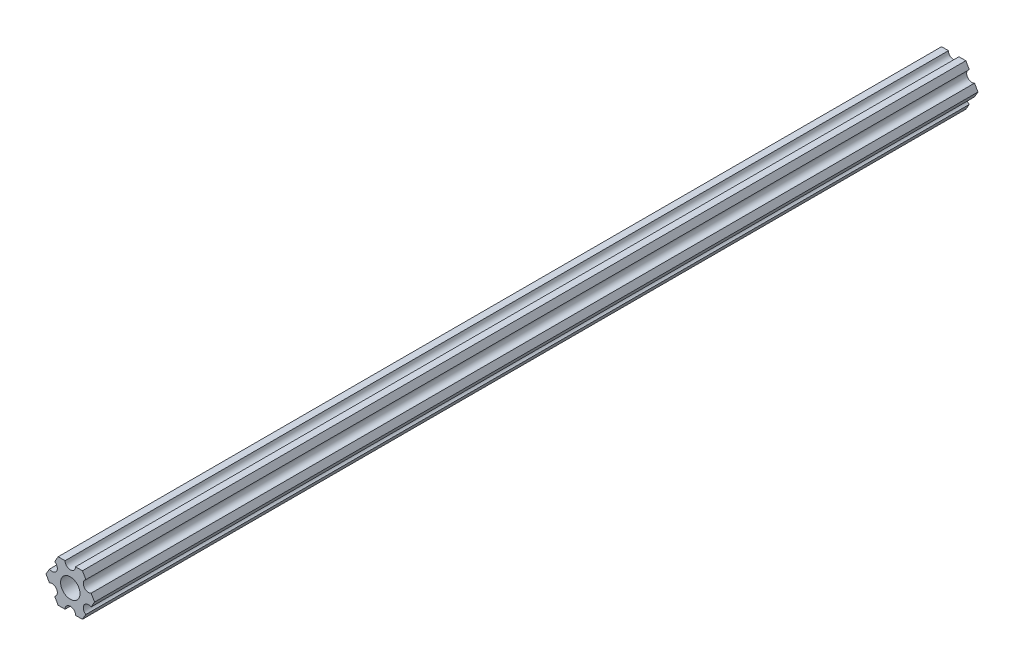
ISO-10303-21;
HEADER;
FILE_DESCRIPTION(('STEP AP214'),'2;1');
FILE_NAME('part.step','',(''),(''),'','','');
FILE_SCHEMA(('AUTOMOTIVE_DESIGN { 1 0 10303 214 1 1 1 1 }'));
ENDSEC;
DATA;
#1=APPLICATION_CONTEXT('core data for automotive mechanical design processes');
#2=APPLICATION_PROTOCOL_DEFINITION('international standard','automotive_design',2000,#1);
#3=PRODUCT_CONTEXT('',#1,'mechanical');
#4=PRODUCT('Part','Part','',(#3));
#5=PRODUCT_RELATED_PRODUCT_CATEGORY('part','',(#4));
#6=PRODUCT_DEFINITION_FORMATION('','',#4);
#7=PRODUCT_DEFINITION_CONTEXT('part definition',#1,'design');
#8=PRODUCT_DEFINITION('design','',#6,#7);
#9=PRODUCT_DEFINITION_SHAPE('','',#8);
#10=(LENGTH_UNIT() NAMED_UNIT(*) SI_UNIT(.MILLI.,.METRE.));
#11=(NAMED_UNIT(*) PLANE_ANGLE_UNIT() SI_UNIT($,.RADIAN.));
#12=(NAMED_UNIT(*) SI_UNIT($,.STERADIAN.) SOLID_ANGLE_UNIT());
#13=UNCERTAINTY_MEASURE_WITH_UNIT(LENGTH_MEASURE(1.E-05),#10,'distance_accuracy_value','');
#14=(GEOMETRIC_REPRESENTATION_CONTEXT(3) GLOBAL_UNCERTAINTY_ASSIGNED_CONTEXT((#13)) GLOBAL_UNIT_ASSIGNED_CONTEXT((#10,
#11,#12)) REPRESENTATION_CONTEXT('',''));
#15=CARTESIAN_POINT('',(0.,0.,0.));
#16=DIRECTION('',(0.,0.,1.));
#17=DIRECTION('',(1.,0.,0.));
#18=AXIS2_PLACEMENT_3D('',#15,#16,#17);
#19=CARTESIAN_POINT('',(6.29301142309098,-1.80018429024546,85.725));
#20=DIRECTION('',(-0.866025434075723,0.499999947533953,0.));
#21=DIRECTION('',(0.,0.,1.));
#22=AXIS2_PLACEMENT_3D('',#19,#20,#21);
#23=PLANE('',#22);
#24=DIRECTION('',(0.,0.,1.));
#25=VECTOR('',#24,1.);
#26=CARTESIAN_POINT('',(7.33234841870827,4.44212519169686E-07,85.725));
#27=LINE('',#26,#25);
#28=CARTESIAN_POINT('',(7.33234841870826,4.44212518961143E-07,0.));
#29=VERTEX_POINT('',#28);
#30=CARTESIAN_POINT('',(7.33234841870826,4.44212518961143E-07,266.7));
#31=VERTEX_POINT('',#30);
#32=EDGE_CURVE('E12',#29,#31,#27,.T.);
#33=ORIENTED_EDGE('',*,*,#32,.T.);
#34=DIRECTION('',(-0.499999947533953,-0.866025434075723,0.));
#35=VECTOR('',#34,1.);
#36=CARTESIAN_POINT('',(6.29301142309098,-1.80018429024546,266.7));
#37=LINE('',#36,#35);
#38=CARTESIAN_POINT('',(6.29301142309098,-1.80018429024546,266.7));
#39=VERTEX_POINT('',#38);
#40=EDGE_CURVE('E221',#31,#39,#37,.T.);
#41=ORIENTED_EDGE('',*,*,#40,.T.);
#42=DIRECTION('',(0.,0.,-1.));
#43=VECTOR('',#42,1.);
#44=CARTESIAN_POINT('',(6.29301142309098,-1.80018429024546,85.725));
#45=LINE('',#44,#43);
#46=CARTESIAN_POINT('',(6.29301142309098,-1.80018429024546,0.));
#47=VERTEX_POINT('',#46);
#48=EDGE_CURVE('E186',#39,#47,#45,.T.);
#49=ORIENTED_EDGE('',*,*,#48,.T.);
#50=DIRECTION('',(0.499999947533953,0.866025434075723,0.));
#51=VECTOR('',#50,1.);
#52=CARTESIAN_POINT('',(6.29301142309098,-1.80018429024546,0.));
#53=LINE('',#52,#51);
#54=EDGE_CURVE('E140',#47,#29,#53,.T.);
#55=ORIENTED_EDGE('',*,*,#54,.T.);
#56=EDGE_LOOP('',(#33,#41,#49,#55));
#57=FACE_BOUND('',#56,.T.);
#58=ADVANCED_FACE('F51',(#57),#23,.F.);
#59=CARTESIAN_POINT('',(7.33234841870827,4.44212519169686E-07,85.725));
#60=DIRECTION('',(-0.866025373493145,-0.500000052466057,0.));
#61=DIRECTION('',(-0.500000052466057,0.866025373493145,0.));
#62=AXIS2_PLACEMENT_3D('',#59,#60,#61);
#63=PLANE('',#62);
#64=DIRECTION('',(0.,0.,1.));
#65=VECTOR('',#64,1.);
#66=CARTESIAN_POINT('',(6.29301120497139,1.80018505273894,85.725));
#67=LINE('',#66,#65);
#68=CARTESIAN_POINT('',(6.29301120497139,1.80018505273894,0.));
#69=VERTEX_POINT('',#68);
#70=CARTESIAN_POINT('',(6.29301120497139,1.80018505273894,266.7));
#71=VERTEX_POINT('',#70);
#72=EDGE_CURVE('E61',#69,#71,#67,.T.);
#73=ORIENTED_EDGE('',*,*,#72,.T.);
#74=DIRECTION('',(0.500000052466055,-0.866025373493146,0.));
#75=VECTOR('',#74,1.);
#76=CARTESIAN_POINT('',(7.33234841870826,4.44212518961143E-07,266.7));
#77=LINE('',#76,#75);
#78=EDGE_CURVE('E217',#71,#31,#77,.T.);
#79=ORIENTED_EDGE('',*,*,#78,.T.);
#80=ORIENTED_EDGE('',*,*,#32,.F.);
#81=DIRECTION('',(-0.500000052466057,0.866025373493145,0.));
#82=VECTOR('',#81,1.);
#83=CARTESIAN_POINT('',(7.33234841870827,4.44212519198906E-07,0.));
#84=LINE('',#83,#82);
#85=EDGE_CURVE('E139',#29,#69,#84,.T.);
#86=ORIENTED_EDGE('',*,*,#85,.T.);
#87=EDGE_LOOP('',(#73,#79,#80,#86));
#88=FACE_BOUND('',#87,.T.);
#89=ADVANCED_FACE('F484',(#88),#63,.F.);
#90=CARTESIAN_POINT('',(4.70551103839172,4.54981561357972,85.725));
#91=DIRECTION('',(-0.866025373493151,-0.500000052466046,0.));
#92=DIRECTION('',(-0.500000052466046,0.866025373493151,0.));
#93=AXIS2_PLACEMENT_3D('',#90,#91,#92);
#94=PLANE('',#93);
#95=DIRECTION('',(0.,0.,1.));
#96=VECTOR('',#95,1.);
#97=CARTESIAN_POINT('',(3.66617382465481,6.35000022210627,85.725));
#98=LINE('',#97,#96);
#99=CARTESIAN_POINT('',(3.66617382465481,6.35000022210627,0.));
#100=VERTEX_POINT('',#99);
#101=CARTESIAN_POINT('',(3.66617382465481,6.35000022210627,266.7));
#102=VERTEX_POINT('',#101);
#103=EDGE_CURVE('E91',#100,#102,#98,.T.);
#104=ORIENTED_EDGE('',*,*,#103,.T.);
#105=DIRECTION('',(0.500000052466045,-0.866025373493151,0.));
#106=VECTOR('',#105,1.);
#107=CARTESIAN_POINT('',(4.70551103839172,4.54981561357972,266.7));
#108=LINE('',#107,#106);
#109=CARTESIAN_POINT('',(4.70551103839172,4.54981561357972,266.7));
#110=VERTEX_POINT('',#109);
#111=EDGE_CURVE('E227',#102,#110,#108,.T.);
#112=ORIENTED_EDGE('',*,*,#111,.T.);
#113=DIRECTION('',(0.,0.,1.));
#114=VECTOR('',#113,1.);
#115=CARTESIAN_POINT('',(4.70551103839172,4.54981561357972,85.725));
#116=LINE('',#115,#114);
#117=CARTESIAN_POINT('',(4.70551103839172,4.54981561357972,0.));
#118=VERTEX_POINT('',#117);
#119=EDGE_CURVE('E113',#118,#110,#116,.T.);
#120=ORIENTED_EDGE('',*,*,#119,.F.);
#121=DIRECTION('',(-0.500000052466046,0.866025373493151,0.));
#122=VECTOR('',#121,1.);
#123=CARTESIAN_POINT('',(4.70551103839172,4.54981561357972,0.));
#124=LINE('',#123,#122);
#125=EDGE_CURVE('E109',#118,#100,#124,.T.);
#126=ORIENTED_EDGE('',*,*,#125,.T.);
#127=EDGE_LOOP('',(#104,#112,#120,#126));
#128=FACE_BOUND('',#127,.T.);
#129=ADVANCED_FACE('F110',(#128),#94,.F.);
#130=CARTESIAN_POINT('',(3.66617382465481,6.35000022210627,85.725));
#131=DIRECTION('',(6.05825850611185E-08,-1.,0.));
#132=DIRECTION('',(0.,0.,-1.));
#133=AXIS2_PLACEMENT_3D('',#130,#131,#132);
#134=PLANE('',#133);
#135=DIRECTION('',(0.,0.,1.));
#136=VECTOR('',#135,1.);
#137=CARTESIAN_POINT('',(1.58749961530074,6.35000009617482,85.725));
#138=LINE('',#137,#136);
#139=CARTESIAN_POINT('',(1.58749961530073,6.35000015914054,0.));
#140=VERTEX_POINT('',#139);
#141=CARTESIAN_POINT('',(1.58749961530074,6.35,266.7));
#142=VERTEX_POINT('',#141);
#143=EDGE_CURVE('E105',#140,#142,#138,.T.);
#144=ORIENTED_EDGE('',*,*,#143,.T.);
#145=DIRECTION('',(1.,3.02912931564594E-08,0.));
#146=VECTOR('',#145,1.);
#147=CARTESIAN_POINT('',(3.66617382465481,6.35000022210627,266.7));
#148=LINE('',#147,#146);
#149=EDGE_CURVE('E100',#142,#102,#148,.T.);
#150=ORIENTED_EDGE('',*,*,#149,.T.);
#151=ORIENTED_EDGE('',*,*,#103,.F.);
#152=DIRECTION('',(-1.,0.,0.));
#153=VECTOR('',#152,1.);
#154=CARTESIAN_POINT('',(5.49926112168156,6.35000022210627,0.));
#155=LINE('',#154,#153);
#156=EDGE_CURVE('E96',#100,#140,#155,.T.);
#157=ORIENTED_EDGE('',*,*,#156,.T.);
#158=EDGE_LOOP('',(#144,#150,#151,#157));
#159=FACE_BOUND('',#158,.T.);
#160=ADVANCED_FACE('F94',(#159),#134,.F.);
#161=CARTESIAN_POINT('',(-3.84699260060323E-07,6.35,85.725));
#162=DIRECTION('',(0.,0.,-1.));
#163=DIRECTION('',(-1.,0.,0.));
#164=AXIS2_PLACEMENT_3D('',#161,#162,#163);
#165=CYLINDRICAL_SURFACE('',#164,1.5875);
#166=DIRECTION('',(0.,0.,1.));
#167=VECTOR('',#166,1.);
#168=CARTESIAN_POINT('',(-1.58750038469926,6.34999990382518,85.725));
#169=LINE('',#168,#167);
#170=CARTESIAN_POINT('',(-1.58750038469926,6.34999990382519,0.));
#171=VERTEX_POINT('',#170);
#172=CARTESIAN_POINT('',(-1.58750038469926,6.34999990382519,266.7));
#173=VERTEX_POINT('',#172);
#174=EDGE_CURVE('E175',#171,#173,#169,.T.);
#175=ORIENTED_EDGE('',*,*,#174,.T.);
#176=CARTESIAN_POINT('',(-3.84699260060323E-07,6.35,266.7));
#177=DIRECTION('',(0.,0.,1.));
#178=DIRECTION('',(1.,0.,0.));
#179=AXIS2_PLACEMENT_3D('',#176,#177,#178);
#180=CIRCLE('',#179,1.5875);
#181=EDGE_CURVE('E230',#173,#142,#180,.T.);
#182=ORIENTED_EDGE('',*,*,#181,.T.);
#183=ORIENTED_EDGE('',*,*,#143,.F.);
#184=CARTESIAN_POINT('',(-3.84699260060323E-07,6.35,0.));
#185=DIRECTION('',(0.,0.,-1.));
#186=DIRECTION('',(-1.,0.,0.));
#187=AXIS2_PLACEMENT_3D('',#184,#185,#186);
#188=CIRCLE('',#187,1.5875);
#189=EDGE_CURVE('E124',#140,#171,#188,.T.);
#190=ORIENTED_EDGE('',*,*,#189,.T.);
#191=EDGE_LOOP('',(#175,#182,#183,#190));
#192=FACE_BOUND('',#191,.T.);
#193=ADVANCED_FACE('F490',(#192),#165,.F.);
#194=CARTESIAN_POINT('',(-1.58750038469926,6.34999990382518,85.725));
#195=DIRECTION('',(6.05825963273174E-08,-1.,0.));
#196=DIRECTION('',(0.,0.,-1.));
#197=AXIS2_PLACEMENT_3D('',#194,#195,#196);
#198=PLANE('',#197);
#199=DIRECTION('',(0.,0.,1.));
#200=VECTOR('',#199,1.);
#201=CARTESIAN_POINT('',(-3.66617459405349,6.3499997778937,85.725));
#202=LINE('',#201,#200);
#203=CARTESIAN_POINT('',(-3.66617454558244,6.34999986184803,0.));
#204=VERTEX_POINT('',#203);
#205=CARTESIAN_POINT('',(-3.66617454558244,6.34999986184803,266.7));
#206=VERTEX_POINT('',#205);
#207=EDGE_CURVE('E171',#204,#206,#202,.T.);
#208=ORIENTED_EDGE('',*,*,#207,.T.);
#209=DIRECTION('',(1.,2.0194198968488E-08,0.));
#210=VECTOR('',#209,1.);
#211=CARTESIAN_POINT('',(-1.58750038469926,6.34999990382519,266.7));
#212=LINE('',#211,#210);
#213=EDGE_CURVE('E233',#206,#173,#212,.T.);
#214=ORIENTED_EDGE('',*,*,#213,.T.);
#215=ORIENTED_EDGE('',*,*,#174,.F.);
#216=DIRECTION('',(-1.,0.,0.));
#217=VECTOR('',#216,1.);
#218=CARTESIAN_POINT('',(5.49926112168156,6.34999990382519,0.));
#219=LINE('',#218,#217);
#220=EDGE_CURVE('E132',#171,#204,#219,.T.);
#221=ORIENTED_EDGE('',*,*,#220,.T.);
#222=EDGE_LOOP('',(#208,#214,#215,#221));
#223=FACE_BOUND('',#222,.T.);
#224=ADVANCED_FACE('F356',(#223),#198,.F.);
#225=CARTESIAN_POINT('',(-3.66617459405349,6.3499997778937,85.725));
#226=DIRECTION('',(0.866025434075729,-0.499999947533942,0.));
#227=DIRECTION('',(0.,0.,-1.));
#228=AXIS2_PLACEMENT_3D('',#225,#226,#227);
#229=PLANE('',#228);
#230=DIRECTION('',(0.,0.,1.));
#231=VECTOR('',#230,1.);
#232=CARTESIAN_POINT('',(-4.70551158967065,4.54981504343587,85.725));
#233=LINE('',#232,#231);
#234=CARTESIAN_POINT('',(-4.70551158967065,4.54981504343587,0.));
#235=VERTEX_POINT('',#234);
#236=CARTESIAN_POINT('',(-4.70551158967065,4.54981504343587,266.7));
#237=VERTEX_POINT('',#236);
#238=EDGE_CURVE('E170',#235,#237,#233,.T.);
#239=ORIENTED_EDGE('',*,*,#238,.T.);
#240=DIRECTION('',(0.499999947533939,0.866025434075731,0.));
#241=VECTOR('',#240,1.);
#242=CARTESIAN_POINT('',(-3.66617454558244,6.34999986184803,266.7));
#243=LINE('',#242,#241);
#244=EDGE_CURVE('E236',#237,#206,#243,.T.);
#245=ORIENTED_EDGE('',*,*,#244,.T.);
#246=ORIENTED_EDGE('',*,*,#207,.F.);
#247=DIRECTION('',(-0.499999947533943,-0.866025434075729,0.));
#248=VECTOR('',#247,1.);
#249=CARTESIAN_POINT('',(-3.66617459405349,6.3499997778937,0.));
#250=LINE('',#249,#248);
#251=EDGE_CURVE('E340',#204,#235,#250,.T.);
#252=ORIENTED_EDGE('',*,*,#251,.T.);
#253=EDGE_LOOP('',(#239,#245,#246,#252));
#254=FACE_BOUND('',#253,.T.);
#255=ADVANCED_FACE('F583',(#254),#229,.F.);
#256=CARTESIAN_POINT('',(-5.49926150638082,3.17499966684067,85.725));
#257=DIRECTION('',(0.,0.,-1.));
#258=DIRECTION('',(-1.,0.,0.));
#259=AXIS2_PLACEMENT_3D('',#256,#257,#258);
#260=CYLINDRICAL_SURFACE('',#259,1.5875);
#261=DIRECTION('',(0.,0.,1.));
#262=VECTOR('',#261,1.);
#263=CARTESIAN_POINT('',(-6.29301142309098,1.80018429024547,85.725));
#264=LINE('',#263,#262);
#265=CARTESIAN_POINT('',(-6.29301142309098,1.80018429024547,0.));
#266=VERTEX_POINT('',#265);
#267=CARTESIAN_POINT('',(-6.29301142309098,1.80018429024546,266.7));
#268=VERTEX_POINT('',#267);
#269=EDGE_CURVE('E148',#266,#268,#264,.T.);
#270=ORIENTED_EDGE('',*,*,#269,.T.);
#271=CARTESIAN_POINT('',(-5.49926150638082,3.17499966684067,266.7));
#272=DIRECTION('',(0.,0.,1.));
#273=DIRECTION('',(1.,0.,0.));
#274=AXIS2_PLACEMENT_3D('',#271,#272,#273);
#275=CIRCLE('',#274,1.5875);
#276=EDGE_CURVE('E239',#268,#237,#275,.T.);
#277=ORIENTED_EDGE('',*,*,#276,.T.);
#278=ORIENTED_EDGE('',*,*,#238,.F.);
#279=CARTESIAN_POINT('',(-5.49926150638082,3.17499966684067,0.));
#280=DIRECTION('',(0.,0.,-1.));
#281=DIRECTION('',(-1.,0.,0.));
#282=AXIS2_PLACEMENT_3D('',#279,#280,#281);
#283=CIRCLE('',#282,1.5875);
#284=EDGE_CURVE('E337',#235,#266,#283,.T.);
#285=ORIENTED_EDGE('',*,*,#284,.T.);
#286=EDGE_LOOP('',(#270,#277,#278,#285));
#287=FACE_BOUND('',#286,.T.);
#288=ADVANCED_FACE('F367',(#287),#260,.F.);
#289=CARTESIAN_POINT('',(-6.29301142309098,1.80018429024547,85.725));
#290=DIRECTION('',(0.866025434075724,-0.499999947533952,0.));
#291=DIRECTION('',(0.,0.,-1.));
#292=AXIS2_PLACEMENT_3D('',#289,#290,#291);
#293=PLANE('',#292);
#294=DIRECTION('',(0.,0.,1.));
#295=VECTOR('',#294,1.);
#296=CARTESIAN_POINT('',(-7.33234841870827,-4.44212523790841E-07,85.725));
#297=LINE('',#296,#295);
#298=CARTESIAN_POINT('',(-7.33234841870826,-4.44212524036367E-07,0.));
#299=VERTEX_POINT('',#298);
#300=CARTESIAN_POINT('',(-7.33234841870826,-4.44212524036367E-07,266.7));
#301=VERTEX_POINT('',#300);
#302=EDGE_CURVE('E144',#299,#301,#297,.T.);
#303=ORIENTED_EDGE('',*,*,#302,.T.);
#304=DIRECTION('',(0.499999947533951,0.866025434075724,0.));
#305=VECTOR('',#304,1.);
#306=CARTESIAN_POINT('',(-6.29301142309098,1.80018429024547,266.7));
#307=LINE('',#306,#305);
#308=EDGE_CURVE('E242',#301,#268,#307,.T.);
#309=ORIENTED_EDGE('',*,*,#308,.T.);
#310=ORIENTED_EDGE('',*,*,#269,.F.);
#311=DIRECTION('',(-0.499999947533952,-0.866025434075724,0.));
#312=VECTOR('',#311,1.);
#313=CARTESIAN_POINT('',(-6.29301142309098,1.80018429024547,0.));
#314=LINE('',#313,#312);
#315=EDGE_CURVE('E333',#266,#299,#314,.T.);
#316=ORIENTED_EDGE('',*,*,#315,.T.);
#317=EDGE_LOOP('',(#303,#309,#310,#316));
#318=FACE_BOUND('',#317,.T.);
#319=ADVANCED_FACE('F620',(#318),#293,.F.);
#320=CARTESIAN_POINT('',(-7.33234841870827,-4.44212523790841E-07,85.725));
#321=DIRECTION('',(0.866025373493151,0.500000052466045,0.));
#322=DIRECTION('',(0.,0.,-1.));
#323=AXIS2_PLACEMENT_3D('',#320,#321,#322);
#324=PLANE('',#323);
#325=DIRECTION('',(0.,0.,1.));
#326=VECTOR('',#325,1.);
#327=CARTESIAN_POINT('',(-6.29301120497141,-1.80018505273897,85.725));
#328=LINE('',#327,#326);
#329=CARTESIAN_POINT('',(-6.29301120497141,-1.80018505273897,0.));
#330=VERTEX_POINT('',#329);
#331=CARTESIAN_POINT('',(-6.29301120497141,-1.80018505273896,266.7));
#332=VERTEX_POINT('',#331);
#333=EDGE_CURVE('E149',#330,#332,#328,.T.);
#334=ORIENTED_EDGE('',*,*,#333,.T.);
#335=DIRECTION('',(-0.500000052466045,0.866025373493152,0.));
#336=VECTOR('',#335,1.);
#337=CARTESIAN_POINT('',(-7.33234841870826,-4.44212524036367E-07,266.7));
#338=LINE('',#337,#336);
#339=EDGE_CURVE('E245',#332,#301,#338,.T.);
#340=ORIENTED_EDGE('',*,*,#339,.T.);
#341=ORIENTED_EDGE('',*,*,#302,.F.);
#342=DIRECTION('',(0.500000052466045,-0.866025373493151,0.));
#343=VECTOR('',#342,1.);
#344=CARTESIAN_POINT('',(-7.33234841870827,-4.44212523969395E-07,0.));
#345=LINE('',#344,#343);
#346=EDGE_CURVE('E312',#299,#330,#345,.T.);
#347=ORIENTED_EDGE('',*,*,#346,.T.);
#348=EDGE_LOOP('',(#334,#340,#341,#347));
#349=FACE_BOUND('',#348,.T.);
#350=ADVANCED_FACE('F644',(#349),#324,.F.);
#351=CARTESIAN_POINT('',(-5.49926112168156,-3.17500033315934,85.725));
#352=DIRECTION('',(0.,0.,-1.));
#353=DIRECTION('',(-1.,0.,0.));
#354=AXIS2_PLACEMENT_3D('',#351,#352,#353);
#355=CYLINDRICAL_SURFACE('',#354,1.5875);
#356=DIRECTION('',(0.,0.,1.));
#357=VECTOR('',#356,1.);
#358=CARTESIAN_POINT('',(-4.70551103839172,-4.54981561357972,85.725));
#359=LINE('',#358,#357);
#360=CARTESIAN_POINT('',(-4.70551103839172,-4.54981561357972,0.));
#361=VERTEX_POINT('',#360);
#362=CARTESIAN_POINT('',(-4.70551103839172,-4.54981561357972,266.7));
#363=VERTEX_POINT('',#362);
#364=EDGE_CURVE('E163',#361,#363,#359,.T.);
#365=ORIENTED_EDGE('',*,*,#364,.T.);
#366=CARTESIAN_POINT('',(-5.49926112168156,-3.17500033315934,266.7));
#367=DIRECTION('',(0.,0.,1.));
#368=DIRECTION('',(1.,0.,0.));
#369=AXIS2_PLACEMENT_3D('',#366,#367,#368);
#370=CIRCLE('',#369,1.5875);
#371=EDGE_CURVE('E248',#363,#332,#370,.T.);
#372=ORIENTED_EDGE('',*,*,#371,.T.);
#373=ORIENTED_EDGE('',*,*,#333,.F.);
#374=CARTESIAN_POINT('',(-5.49926112168156,-3.17500033315934,0.));
#375=DIRECTION('',(0.,0.,-1.));
#376=DIRECTION('',(-1.,0.,0.));
#377=AXIS2_PLACEMENT_3D('',#374,#375,#376);
#378=CIRCLE('',#377,1.5875);
#379=EDGE_CURVE('E308',#330,#361,#378,.T.);
#380=ORIENTED_EDGE('',*,*,#379,.T.);
#381=EDGE_LOOP('',(#365,#372,#373,#380));
#382=FACE_BOUND('',#381,.T.);
#383=ADVANCED_FACE('F600',(#382),#355,.F.);
#384=CARTESIAN_POINT('',(-4.70551103839172,-4.54981561357972,85.725));
#385=DIRECTION('',(0.866025373493152,0.500000052466045,0.));
#386=DIRECTION('',(0.,0.,-1.));
#387=AXIS2_PLACEMENT_3D('',#384,#385,#386);
#388=PLANE('',#387);
#389=DIRECTION('',(0.,0.,1.));
#390=VECTOR('',#389,1.);
#391=CARTESIAN_POINT('',(-3.66617382465481,-6.35000022210628,85.725));
#392=LINE('',#391,#390);
#393=CARTESIAN_POINT('',(-3.66617382465481,-6.35000022210628,0.));
#394=VERTEX_POINT('',#393);
#395=CARTESIAN_POINT('',(-3.66617382465481,-6.35000022210628,266.7));
#396=VERTEX_POINT('',#395);
#397=EDGE_CURVE('E159',#394,#396,#392,.T.);
#398=ORIENTED_EDGE('',*,*,#397,.T.);
#399=DIRECTION('',(-0.500000052466043,0.866025373493153,0.));
#400=VECTOR('',#399,1.);
#401=CARTESIAN_POINT('',(-4.70551103839172,-4.54981561357972,266.7));
#402=LINE('',#401,#400);
#403=EDGE_CURVE('E251',#396,#363,#402,.T.);
#404=ORIENTED_EDGE('',*,*,#403,.T.);
#405=ORIENTED_EDGE('',*,*,#364,.F.);
#406=DIRECTION('',(0.500000052466045,-0.866025373493151,0.));
#407=VECTOR('',#406,1.);
#408=CARTESIAN_POINT('',(-4.70551103839172,-4.54981561357972,0.));
#409=LINE('',#408,#407);
#410=EDGE_CURVE('E313',#361,#394,#409,.T.);
#411=ORIENTED_EDGE('',*,*,#410,.T.);
#412=EDGE_LOOP('',(#398,#404,#405,#411));
#413=FACE_BOUND('',#412,.T.);
#414=ADVANCED_FACE('F595',(#413),#388,.F.);
#415=CARTESIAN_POINT('',(-3.66617382465481,-6.35000022210628,85.725));
#416=DIRECTION('',(-6.05825854783851E-08,1.,0.));
#417=DIRECTION('',(0.,0.,1.));
#418=AXIS2_PLACEMENT_3D('',#415,#416,#417);
#419=PLANE('',#418);
#420=DIRECTION('',(0.,0.,1.));
#421=VECTOR('',#420,1.);
#422=CARTESIAN_POINT('',(-1.58749961530074,-6.35,85.725));
#423=LINE('',#422,#421);
#424=CARTESIAN_POINT('',(-1.58749961530073,-6.35000011105314,0.));
#425=VERTEX_POINT('',#424);
#426=CARTESIAN_POINT('',(-1.58749961530073,-6.35000011105314,266.7));
#427=VERTEX_POINT('',#426);
#428=EDGE_CURVE('E158',#425,#427,#423,.T.);
#429=ORIENTED_EDGE('',*,*,#428,.T.);
#430=DIRECTION('',(-0.999999999999999,-5.34249856349037E-08,0.));
#431=VECTOR('',#430,1.);
#432=CARTESIAN_POINT('',(-3.66617382465481,-6.35000022210628,266.7));
#433=LINE('',#432,#431);
#434=EDGE_CURVE('E254',#427,#396,#433,.T.);
#435=ORIENTED_EDGE('',*,*,#434,.T.);
#436=ORIENTED_EDGE('',*,*,#397,.F.);
#437=DIRECTION('',(1.,0.,0.));
#438=VECTOR('',#437,1.);
#439=CARTESIAN_POINT('',(5.49926112168156,-6.35000022210628,0.));
#440=LINE('',#439,#438);
#441=EDGE_CURVE('E323',#394,#425,#440,.T.);
#442=ORIENTED_EDGE('',*,*,#441,.T.);
#443=EDGE_LOOP('',(#429,#435,#436,#442));
#444=FACE_BOUND('',#443,.T.);
#445=ADVANCED_FACE('F599',(#444),#419,.F.);
#446=CARTESIAN_POINT('',(3.8469926204343E-07,-6.35,85.725));
#447=DIRECTION('',(0.,0.,-1.));
#448=DIRECTION('',(-1.,0.,0.));
#449=AXIS2_PLACEMENT_3D('',#446,#447,#448);
#450=CYLINDRICAL_SURFACE('',#449,1.5875);
#451=DIRECTION('',(0.,0.,1.));
#452=VECTOR('',#451,1.);
#453=CARTESIAN_POINT('',(1.58750038469926,-6.34999990382518,85.725));
#454=LINE('',#453,#452);
#455=CARTESIAN_POINT('',(1.58750038469926,-6.34999990382519,0.));
#456=VERTEX_POINT('',#455);
#457=CARTESIAN_POINT('',(1.58750038469926,-6.34999990382519,266.7));
#458=VERTEX_POINT('',#457);
#459=EDGE_CURVE('E154',#456,#458,#454,.T.);
#460=ORIENTED_EDGE('',*,*,#459,.T.);
#461=CARTESIAN_POINT('',(3.8469926204343E-07,-6.35,266.7));
#462=DIRECTION('',(0.,0.,1.));
#463=DIRECTION('',(1.,0.,0.));
#464=AXIS2_PLACEMENT_3D('',#461,#462,#463);
#465=CIRCLE('',#464,1.5875);
#466=EDGE_CURVE('E257',#458,#427,#465,.T.);
#467=ORIENTED_EDGE('',*,*,#466,.T.);
#468=ORIENTED_EDGE('',*,*,#428,.F.);
#469=CARTESIAN_POINT('',(3.8469926204343E-07,-6.35,0.));
#470=DIRECTION('',(0.,0.,-1.));
#471=DIRECTION('',(-1.,0.,0.));
#472=AXIS2_PLACEMENT_3D('',#469,#470,#471);
#473=CIRCLE('',#472,1.5875);
#474=EDGE_CURVE('E285',#425,#456,#473,.T.);
#475=ORIENTED_EDGE('',*,*,#474,.T.);
#476=EDGE_LOOP('',(#460,#467,#468,#475));
#477=FACE_BOUND('',#476,.T.);
#478=ADVANCED_FACE('F611',(#477),#450,.F.);
#479=CARTESIAN_POINT('',(1.58750038469926,-6.34999990382518,85.725));
#480=DIRECTION('',(-6.05825721258438E-08,1.,0.));
#481=DIRECTION('',(0.,0.,1.));
#482=AXIS2_PLACEMENT_3D('',#479,#480,#481);
#483=PLANE('',#482);
#484=DIRECTION('',(0.,0.,1.));
#485=VECTOR('',#484,1.);
#486=CARTESIAN_POINT('',(3.66617459405346,-6.34999977789375,85.725));
#487=LINE('',#486,#485);
#488=CARTESIAN_POINT('',(3.66617454558244,-6.34999986184804,0.));
#489=VERTEX_POINT('',#488);
#490=CARTESIAN_POINT('',(3.66617454558244,-6.34999986184804,266.7));
#491=VERTEX_POINT('',#490);
#492=EDGE_CURVE('E153',#489,#491,#487,.T.);
#493=ORIENTED_EDGE('',*,*,#492,.T.);
#494=DIRECTION('',(-1.,-2.01941943785532E-08,0.));
#495=VECTOR('',#494,1.);
#496=CARTESIAN_POINT('',(1.58750038469926,-6.34999990382519,266.7));
#497=LINE('',#496,#495);
#498=EDGE_CURVE('E260',#491,#458,#497,.T.);
#499=ORIENTED_EDGE('',*,*,#498,.T.);
#500=ORIENTED_EDGE('',*,*,#459,.F.);
#501=DIRECTION('',(1.,0.,0.));
#502=VECTOR('',#501,1.);
#503=CARTESIAN_POINT('',(5.49926112168156,-6.34999990382519,0.));
#504=LINE('',#503,#502);
#505=EDGE_CURVE('E282',#456,#489,#504,.T.);
#506=ORIENTED_EDGE('',*,*,#505,.T.);
#507=EDGE_LOOP('',(#493,#499,#500,#506));
#508=FACE_BOUND('',#507,.T.);
#509=ADVANCED_FACE('F606',(#508),#483,.F.);
#510=CARTESIAN_POINT('',(3.66617459405346,-6.34999977789375,85.725));
#511=DIRECTION('',(-0.86602543407573,0.499999947533941,0.));
#512=DIRECTION('',(0.,0.,1.));
#513=AXIS2_PLACEMENT_3D('',#510,#511,#512);
#514=PLANE('',#513);
#515=DIRECTION('',(0.,0.,-1.));
#516=VECTOR('',#515,1.);
#517=CARTESIAN_POINT('',(4.70551158967065,-4.54981504343587,85.725));
#518=LINE('',#517,#516);
#519=CARTESIAN_POINT('',(4.70551158967065,-4.54981504343587,266.7));
#520=VERTEX_POINT('',#519);
#521=CARTESIAN_POINT('',(4.70551158967065,-4.54981504343587,0.));
#522=VERTEX_POINT('',#521);
#523=EDGE_CURVE('E143',#520,#522,#518,.T.);
#524=ORIENTED_EDGE('',*,*,#523,.F.);
#525=DIRECTION('',(-0.499999947533941,-0.86602543407573,0.));
#526=VECTOR('',#525,1.);
#527=CARTESIAN_POINT('',(3.66617454558244,-6.34999986184804,266.7));
#528=LINE('',#527,#526);
#529=EDGE_CURVE('E263',#520,#491,#528,.T.);
#530=ORIENTED_EDGE('',*,*,#529,.T.);
#531=ORIENTED_EDGE('',*,*,#492,.F.);
#532=DIRECTION('',(0.49999994753394,0.86602543407573,0.));
#533=VECTOR('',#532,1.);
#534=CARTESIAN_POINT('',(3.66617459405346,-6.34999977789376,0.));
#535=LINE('',#534,#533);
#536=EDGE_CURVE('E276',#489,#522,#535,.T.);
#537=ORIENTED_EDGE('',*,*,#536,.T.);
#538=EDGE_LOOP('',(#524,#530,#531,#537));
#539=FACE_BOUND('',#538,.T.);
#540=ADVANCED_FACE('F610',(#539),#514,.F.);
#541=CARTESIAN_POINT('',(5.49926112168156,3.17500033315934,0.));
#542=DIRECTION('',(0.,0.,1.));
#543=DIRECTION('',(1.,0.,0.));
#544=AXIS2_PLACEMENT_3D('',#541,#542,#543);
#545=PLANE('',#544);
#546=CARTESIAN_POINT('',(0.,0.,0.));
#547=DIRECTION('',(0.,0.,1.));
#548=DIRECTION('',(-1.,0.,0.));
#549=AXIS2_PLACEMENT_3D('',#546,#547,#548);
#550=CIRCLE('',#549,2.9337);
#551=CARTESIAN_POINT('',(-2.9337,0.,0.));
#552=VERTEX_POINT('',#551);
#553=CARTESIAN_POINT('',(2.9337,0.,0.));
#554=VERTEX_POINT('',#553);
#555=EDGE_CURVE('E200',#552,#554,#550,.T.);
#556=ORIENTED_EDGE('',*,*,#555,.T.);
#557=CARTESIAN_POINT('',(0.,0.,0.));
#558=DIRECTION('',(0.,0.,1.));
#559=DIRECTION('',(-1.,0.,0.));
#560=AXIS2_PLACEMENT_3D('',#557,#558,#559);
#561=CIRCLE('',#560,2.9337);
#562=EDGE_CURVE('E277',#554,#552,#561,.T.);
#563=ORIENTED_EDGE('',*,*,#562,.T.);
#564=EDGE_LOOP('',(#556,#563));
#565=FACE_BOUND('',#564,.T.);
#566=CARTESIAN_POINT('',(5.49926150638082,-3.17499966684067,0.));
#567=DIRECTION('',(0.,0.,-1.));
#568=DIRECTION('',(-1.,0.,0.));
#569=AXIS2_PLACEMENT_3D('',#566,#567,#568);
#570=CIRCLE('',#569,1.5875);
#571=CARTESIAN_POINT('',(3.91176150638082,-3.17499966684067,0.));
#572=VERTEX_POINT('',#571);
#573=EDGE_CURVE('E274',#522,#572,#570,.T.);
#574=ORIENTED_EDGE('',*,*,#573,.F.);
#575=ORIENTED_EDGE('',*,*,#536,.F.);
#576=ORIENTED_EDGE('',*,*,#505,.F.);
#577=ORIENTED_EDGE('',*,*,#474,.F.);
#578=ORIENTED_EDGE('',*,*,#441,.F.);
#579=ORIENTED_EDGE('',*,*,#410,.F.);
#580=ORIENTED_EDGE('',*,*,#379,.F.);
#581=ORIENTED_EDGE('',*,*,#346,.F.);
#582=ORIENTED_EDGE('',*,*,#315,.F.);
#583=ORIENTED_EDGE('',*,*,#284,.F.);
#584=ORIENTED_EDGE('',*,*,#251,.F.);
#585=ORIENTED_EDGE('',*,*,#220,.F.);
#586=ORIENTED_EDGE('',*,*,#189,.F.);
#587=ORIENTED_EDGE('',*,*,#156,.F.);
#588=ORIENTED_EDGE('',*,*,#125,.F.);
#589=CARTESIAN_POINT('',(5.49926112168156,3.17500033315934,0.));
#590=DIRECTION('',(0.,0.,-1.));
#591=DIRECTION('',(-1.,0.,0.));
#592=AXIS2_PLACEMENT_3D('',#589,#590,#591);
#593=CIRCLE('',#592,1.5875);
#594=CARTESIAN_POINT('',(3.91176112168156,3.17500033315934,0.));
#595=VERTEX_POINT('',#594);
#596=EDGE_CURVE('E185',#595,#118,#593,.T.);
#597=ORIENTED_EDGE('',*,*,#596,.F.);
#598=CARTESIAN_POINT('',(5.49926112168156,3.17500033315934,0.));
#599=DIRECTION('',(0.,0.,-1.));
#600=DIRECTION('',(-1.,0.,0.));
#601=AXIS2_PLACEMENT_3D('',#598,#599,#600);
#602=CIRCLE('',#601,1.5875);
#603=EDGE_CURVE('E118',#69,#595,#602,.T.);
#604=ORIENTED_EDGE('',*,*,#603,.F.);
#605=ORIENTED_EDGE('',*,*,#85,.F.);
#606=ORIENTED_EDGE('',*,*,#54,.F.);
#607=CARTESIAN_POINT('',(5.49926150638082,-3.17499966684067,0.));
#608=DIRECTION('',(0.,0.,-1.));
#609=DIRECTION('',(-1.,0.,0.));
#610=AXIS2_PLACEMENT_3D('',#607,#608,#609);
#611=CIRCLE('',#610,1.5875);
#612=EDGE_CURVE('E193',#572,#47,#611,.T.);
#613=ORIENTED_EDGE('',*,*,#612,.F.);
#614=EDGE_LOOP('',(#574,#575,#576,#577,#578,#579,#580,#581,#582,#583,#584,#585,#586,#587,#588,
#597,#604,#605,#606,#613));
#615=FACE_BOUND('',#614,.T.);
#616=ADVANCED_FACE('F121',(#565,#615),#545,.F.);
#617=CARTESIAN_POINT('',(5.49926112168156,3.17500033315934,85.725));
#618=DIRECTION('',(0.,0.,-1.));
#619=DIRECTION('',(-1.,0.,0.));
#620=AXIS2_PLACEMENT_3D('',#617,#618,#619);
#621=CYLINDRICAL_SURFACE('',#620,1.5875);
#622=ORIENTED_EDGE('',*,*,#119,.T.);
#623=CARTESIAN_POINT('',(5.49926112168156,3.17500033315934,266.7));
#624=DIRECTION('',(0.,0.,1.));
#625=DIRECTION('',(1.,0.,0.));
#626=AXIS2_PLACEMENT_3D('',#623,#624,#625);
#627=CIRCLE('',#626,1.5875);
#628=EDGE_CURVE('E224',#110,#71,#627,.T.);
#629=ORIENTED_EDGE('',*,*,#628,.T.);
#630=ORIENTED_EDGE('',*,*,#72,.F.);
#631=ORIENTED_EDGE('',*,*,#603,.T.);
#632=DIRECTION('',(0.,0.,-1.));
#633=VECTOR('',#632,1.);
#634=CARTESIAN_POINT('',(3.91176112168156,3.17500033315934,85.725));
#635=LINE('',#634,#633);
#636=CARTESIAN_POINT('',(3.91176112168156,3.17500033315934,85.725));
#637=VERTEX_POINT('',#636);
#638=EDGE_CURVE('E181',#637,#595,#635,.T.);
#639=ORIENTED_EDGE('',*,*,#638,.F.);
#640=ORIENTED_EDGE('',*,*,#638,.T.);
#641=ORIENTED_EDGE('',*,*,#596,.T.);
#642=EDGE_LOOP('',(#622,#629,#630,#631,#639,#640,#641));
#643=FACE_BOUND('',#642,.T.);
#644=ADVANCED_FACE('F487',(#643),#621,.F.);
#645=CARTESIAN_POINT('',(5.49926150638082,-3.17499966684067,85.725));
#646=DIRECTION('',(0.,0.,-1.));
#647=DIRECTION('',(-1.,0.,0.));
#648=AXIS2_PLACEMENT_3D('',#645,#646,#647);
#649=CYLINDRICAL_SURFACE('',#648,1.5875);
#650=ORIENTED_EDGE('',*,*,#48,.F.);
#651=CARTESIAN_POINT('',(5.49926150638082,-3.17499966684067,266.7));
#652=DIRECTION('',(0.,0.,1.));
#653=DIRECTION('',(1.,0.,0.));
#654=AXIS2_PLACEMENT_3D('',#651,#652,#653);
#655=CIRCLE('',#654,1.5875);
#656=EDGE_CURVE('E266',#39,#520,#655,.T.);
#657=ORIENTED_EDGE('',*,*,#656,.T.);
#658=ORIENTED_EDGE('',*,*,#523,.T.);
#659=ORIENTED_EDGE('',*,*,#573,.T.);
#660=DIRECTION('',(0.,0.,-1.));
#661=VECTOR('',#660,1.);
#662=CARTESIAN_POINT('',(3.91176150638082,-3.17499966684067,85.725));
#663=LINE('',#662,#661);
#664=CARTESIAN_POINT('',(3.91176150638082,-3.17499966684067,85.725));
#665=VERTEX_POINT('',#664);
#666=EDGE_CURVE('E189',#665,#572,#663,.T.);
#667=ORIENTED_EDGE('',*,*,#666,.F.);
#668=ORIENTED_EDGE('',*,*,#666,.T.);
#669=ORIENTED_EDGE('',*,*,#612,.T.);
#670=EDGE_LOOP('',(#650,#657,#658,#659,#667,#668,#669));
#671=FACE_BOUND('',#670,.T.);
#672=ADVANCED_FACE('F676',(#671),#649,.F.);
#673=CARTESIAN_POINT('',(0.,0.,85.725));
#674=DIRECTION('',(0.,0.,-1.));
#675=DIRECTION('',(-1.,0.,0.));
#676=AXIS2_PLACEMENT_3D('',#673,#674,#675);
#677=CYLINDRICAL_SURFACE('',#676,2.9337);
#678=DIRECTION('',(0.,0.,-1.));
#679=VECTOR('',#678,1.);
#680=CARTESIAN_POINT('',(-2.9337,0.,85.725));
#681=LINE('',#680,#679);
#682=CARTESIAN_POINT('',(-2.9337,0.,85.725));
#683=VERTEX_POINT('',#682);
#684=EDGE_CURVE('E194',#683,#552,#681,.T.);
#685=ORIENTED_EDGE('',*,*,#684,.F.);
#686=ORIENTED_EDGE('',*,*,#684,.T.);
#687=ORIENTED_EDGE('',*,*,#562,.F.);
#688=DIRECTION('',(0.,0.,-1.));
#689=VECTOR('',#688,1.);
#690=CARTESIAN_POINT('',(2.9337,0.,85.725));
#691=LINE('',#690,#689);
#692=CARTESIAN_POINT('',(2.9337,0.,85.725));
#693=VERTEX_POINT('',#692);
#694=EDGE_CURVE('E202',#693,#554,#691,.T.);
#695=ORIENTED_EDGE('',*,*,#694,.F.);
#696=ORIENTED_EDGE('',*,*,#694,.T.);
#697=ORIENTED_EDGE('',*,*,#555,.F.);
#698=EDGE_LOOP('',(#685,#686,#687,#695,#696,#697));
#699=FACE_BOUND('',#698,.T.);
#700=CARTESIAN_POINT('',(0.,0.,266.7));
#701=DIRECTION('',(0.,0.,1.));
#702=DIRECTION('',(1.,0.,0.));
#703=AXIS2_PLACEMENT_3D('',#700,#701,#702);
#704=CIRCLE('',#703,2.9337);
#705=CARTESIAN_POINT('',(2.9337,0.,266.7));
#706=VERTEX_POINT('',#705);
#707=EDGE_CURVE('E205',#706,#706,#704,.F.);
#708=ORIENTED_EDGE('',*,*,#707,.F.);
#709=EDGE_LOOP('',(#708));
#710=FACE_BOUND('',#709,.T.);
#711=ADVANCED_FACE('F684',(#699,#710),#677,.F.);
#712=CARTESIAN_POINT('',(5.49926112168156,3.17500033315934,266.7));
#713=DIRECTION('',(0.,0.,1.));
#714=DIRECTION('',(1.,0.,0.));
#715=AXIS2_PLACEMENT_3D('',#712,#713,#714);
#716=PLANE('',#715);
#717=ORIENTED_EDGE('',*,*,#628,.F.);
#718=ORIENTED_EDGE('',*,*,#111,.F.);
#719=ORIENTED_EDGE('',*,*,#149,.F.);
#720=ORIENTED_EDGE('',*,*,#181,.F.);
#721=ORIENTED_EDGE('',*,*,#213,.F.);
#722=ORIENTED_EDGE('',*,*,#244,.F.);
#723=ORIENTED_EDGE('',*,*,#276,.F.);
#724=ORIENTED_EDGE('',*,*,#308,.F.);
#725=ORIENTED_EDGE('',*,*,#339,.F.);
#726=ORIENTED_EDGE('',*,*,#371,.F.);
#727=ORIENTED_EDGE('',*,*,#403,.F.);
#728=ORIENTED_EDGE('',*,*,#434,.F.);
#729=ORIENTED_EDGE('',*,*,#466,.F.);
#730=ORIENTED_EDGE('',*,*,#498,.F.);
#731=ORIENTED_EDGE('',*,*,#529,.F.);
#732=ORIENTED_EDGE('',*,*,#656,.F.);
#733=ORIENTED_EDGE('',*,*,#40,.F.);
#734=ORIENTED_EDGE('',*,*,#78,.F.);
#735=EDGE_LOOP('',(#717,#718,#719,#720,#721,#722,#723,#724,#725,#726,#727,#728,#729,#730,#731,
#732,#733,#734));
#736=FACE_BOUND('',#735,.T.);
#737=ORIENTED_EDGE('',*,*,#707,.T.);
#738=EDGE_LOOP('',(#737));
#739=FACE_BOUND('',#738,.T.);
#740=ADVANCED_FACE('F482',(#736,#739),#716,.T.);
#741=CLOSED_SHELL('',(#58,#89,#129,#160,#193,#224,#255,#288,#319,#350,#383,#414,#445,#478,#509,
#540,#616,#644,#672,#711,#740));
#742=MANIFOLD_SOLID_BREP('B2',#741);
#743=ADVANCED_BREP_SHAPE_REPRESENTATION('',(#18,#742),#14);
#744=SHAPE_DEFINITION_REPRESENTATION(#9,#743);
ENDSEC;
END-ISO-10303-21;
